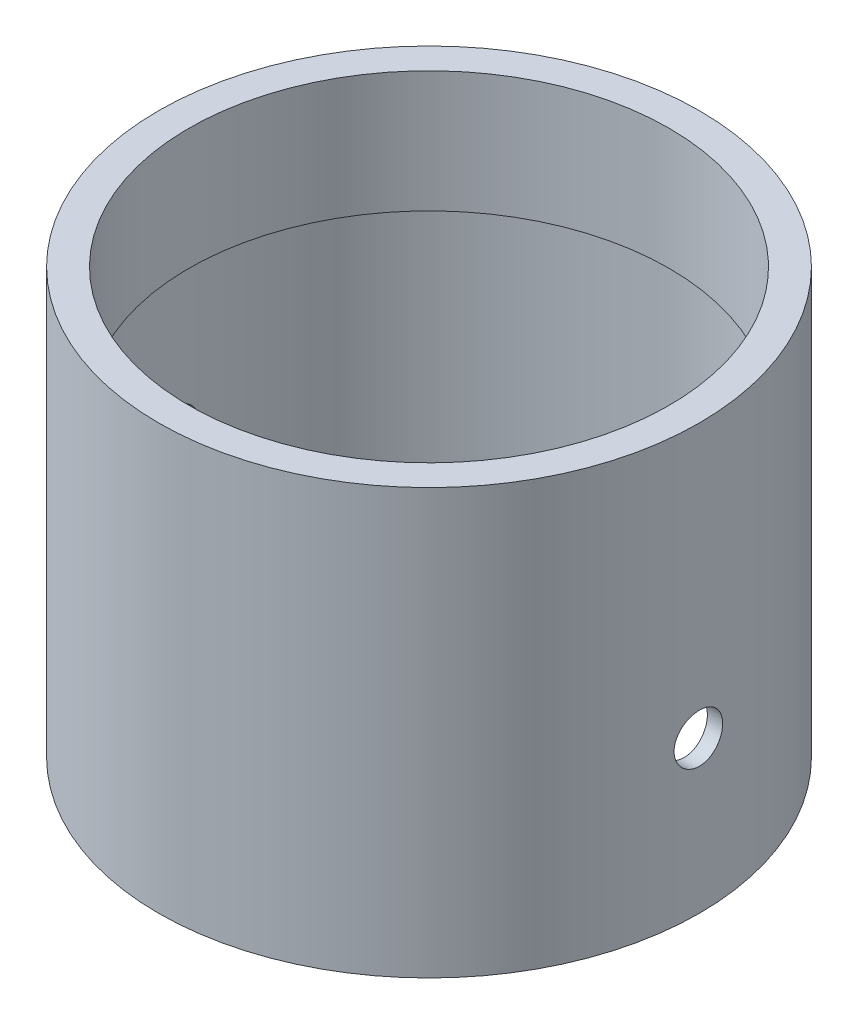
ISO-10303-21;
HEADER;
FILE_DESCRIPTION(('STEP AP214'),'2;1');
FILE_NAME('part.step','',(''),(''),'','','');
FILE_SCHEMA(('AUTOMOTIVE_DESIGN { 1 0 10303 214 1 1 1 1 }'));
ENDSEC;
DATA;
#1=APPLICATION_CONTEXT('core data for automotive mechanical design processes');
#2=APPLICATION_PROTOCOL_DEFINITION('international standard','automotive_design',2000,#1);
#3=PRODUCT_CONTEXT('',#1,'mechanical');
#4=PRODUCT('Part','Part','',(#3));
#5=PRODUCT_RELATED_PRODUCT_CATEGORY('part','',(#4));
#6=PRODUCT_DEFINITION_FORMATION('','',#4);
#7=PRODUCT_DEFINITION_CONTEXT('part definition',#1,'design');
#8=PRODUCT_DEFINITION('design','',#6,#7);
#9=PRODUCT_DEFINITION_SHAPE('','',#8);
#10=(LENGTH_UNIT() NAMED_UNIT(*) SI_UNIT(.MILLI.,.METRE.));
#11=(NAMED_UNIT(*) PLANE_ANGLE_UNIT() SI_UNIT($,.RADIAN.));
#12=(NAMED_UNIT(*) SI_UNIT($,.STERADIAN.) SOLID_ANGLE_UNIT());
#13=UNCERTAINTY_MEASURE_WITH_UNIT(LENGTH_MEASURE(1.E-05),#10,'distance_accuracy_value','');
#14=(GEOMETRIC_REPRESENTATION_CONTEXT(3) GLOBAL_UNCERTAINTY_ASSIGNED_CONTEXT((#13)) GLOBAL_UNIT_ASSIGNED_CONTEXT((#10,
#11,#12)) REPRESENTATION_CONTEXT('',''));
#15=CARTESIAN_POINT('',(0.,0.,0.));
#16=DIRECTION('',(0.,0.,1.));
#17=DIRECTION('',(1.,0.,0.));
#18=AXIS2_PLACEMENT_3D('',#15,#16,#17);
#19=CARTESIAN_POINT('',(0.,10.,0.));
#20=DIRECTION('',(0.,-1.,0.));
#21=DIRECTION('',(0.,0.,-1.));
#22=AXIS2_PLACEMENT_3D('',#19,#20,#21);
#23=CYLINDRICAL_SURFACE('',#22,19.7871926);
#24=CARTESIAN_POINT('',(0.,-20.,0.));
#25=DIRECTION('',(0.,-1.,0.));
#26=DIRECTION('',(0.,0.,-1.));
#27=AXIS2_PLACEMENT_3D('',#24,#25,#26);
#28=CIRCLE('',#27,19.7871926);
#29=CARTESIAN_POINT('',(0.,-20.,-19.7871926));
#30=VERTEX_POINT('',#29);
#31=EDGE_CURVE('E123',#30,#30,#28,.F.);
#32=ORIENTED_EDGE('',*,*,#31,.T.);
#33=EDGE_LOOP('',(#32));
#34=FACE_BOUND('',#33,.T.);
#35=CARTESIAN_POINT('',(0.,-30.,0.));
#36=DIRECTION('',(0.,-1.,0.));
#37=DIRECTION('',(0.,0.,-1.));
#38=AXIS2_PLACEMENT_3D('',#35,#36,#37);
#39=CIRCLE('',#38,19.7871926);
#40=CARTESIAN_POINT('',(0.,-30.,-19.7871926));
#41=VERTEX_POINT('',#40);
#42=EDGE_CURVE('E126',#41,#41,#39,.T.);
#43=ORIENTED_EDGE('',*,*,#42,.T.);
#44=EDGE_LOOP('',(#43));
#45=FACE_BOUND('',#44,.T.);
#46=ADVANCED_FACE('F42',(#34,#45),#23,.F.);
#47=CARTESIAN_POINT('',(0.,-55.,0.));
#48=DIRECTION('',(0.,1.,0.));
#49=DIRECTION('',(0.,0.,1.));
#50=AXIS2_PLACEMENT_3D('',#47,#48,#49);
#51=CYLINDRICAL_SURFACE('',#50,22.2871926);
#52=CARTESIAN_POINT('',(22.1972735710829,-42.5,2.));
#53=CARTESIAN_POINT('',(22.1972747578384,-42.6120979487833,1.99999511742206));
#54=CARTESIAN_POINT('',(22.1981318713446,-42.7242714162903,1.990543818689));
#55=CARTESIAN_POINT('',(22.2014675221558,-42.9455123542723,1.95298122193684));
#56=CARTESIAN_POINT('',(22.2039478783657,-43.0545761970581,1.92484899070827));
#57=CARTESIAN_POINT('',(22.210246844414,-43.2663616954607,1.85074673635096));
#58=CARTESIAN_POINT('',(22.2140646763531,-43.3690869969256,1.8047870803025));
#59=CARTESIAN_POINT('',(22.2226074531708,-43.5653415959197,1.69635359363768));
#60=CARTESIAN_POINT('',(22.2273322090682,-43.6588728031483,1.63388320244131));
#61=CARTESIAN_POINT('',(22.2371721337219,-43.8343842266705,1.49400257964117));
#62=CARTESIAN_POINT('',(22.2422882941835,-43.9163334959603,1.41655358427251));
#63=CARTESIAN_POINT('',(22.2523255157385,-44.0660886952276,1.24899661663564));
#64=CARTESIAN_POINT('',(22.2572465681556,-44.1338939968124,1.15888808222299));
#65=CARTESIAN_POINT('',(22.2663486688275,-44.2535411573696,0.968383200456265));
#66=CARTESIAN_POINT('',(22.2705284588251,-44.3053559815363,0.867969808575246));
#67=CARTESIAN_POINT('',(22.2776663557045,-44.391378424981,0.659824263836162));
#68=CARTESIAN_POINT('',(22.2806244870105,-44.4255863962678,0.552092257345798));
#69=CARTESIAN_POINT('',(22.2849788219677,-44.4753343035201,0.332677649173622));
#70=CARTESIAN_POINT('',(22.2863792415886,-44.4909246368645,0.221006559086602));
#71=CARTESIAN_POINT('',(22.2874746715091,-44.5031505637352,-0.00337546761511587));
#72=CARTESIAN_POINT('',(22.287169718065,-44.4997865602311,-0.116086382072268));
#73=CARTESIAN_POINT('',(22.2848922298026,-44.4742404087816,-0.339006741680388));
#74=CARTESIAN_POINT('',(22.2829244974277,-44.4521124542975,-0.44922245317486));
#75=CARTESIAN_POINT('',(22.2775482296399,-44.389750856663,-0.664369168517825));
#76=CARTESIAN_POINT('',(22.2741396786775,-44.3495170181116,-0.769300115318885));
#77=CARTESIAN_POINT('',(22.2662568836501,-44.2520256990304,-0.971070558621094));
#78=CARTESIAN_POINT('',(22.2617811285953,-44.1947440527419,-1.06789831730319));
#79=CARTESIAN_POINT('',(22.252266629674,-44.0648006794693,-1.25058570005472));
#80=CARTESIAN_POINT('',(22.2472278725395,-43.992138589982,-1.33644506553248));
#81=CARTESIAN_POINT('',(22.2371323841951,-43.8331917383666,-1.49507549578169));
#82=CARTESIAN_POINT('',(22.2320756522269,-43.7468598662908,-1.56779936485416));
#83=CARTESIAN_POINT('',(22.2225319486924,-43.5631879647968,-1.69772953841518));
#84=CARTESIAN_POINT('',(22.2180449777122,-43.465847924058,-1.75493582694544));
#85=CARTESIAN_POINT('',(22.2101481626183,-43.2628885373283,-1.8522057349068));
#86=CARTESIAN_POINT('',(22.2067384830431,-43.1572679296896,-1.89226673600946));
#87=CARTESIAN_POINT('',(22.2013856168003,-42.9407621652327,-1.95407307096022));
#88=CARTESIAN_POINT('',(22.1994423943012,-42.8298771371162,-1.97581885232471));
#89=CARTESIAN_POINT('',(22.1972484360612,-42.6064036214521,-2.00031736919359));
#90=CARTESIAN_POINT('',(22.1969918287129,-42.4938224126005,-2.0031359964759));
#91=CARTESIAN_POINT('',(22.1981846600312,-42.2697891652291,-1.98987295841871));
#92=CARTESIAN_POINT('',(22.1996340802026,-42.1583371144812,-1.97379149797679));
#93=CARTESIAN_POINT('',(22.2040703057082,-41.9399161135504,-1.92323978146857));
#94=CARTESIAN_POINT('',(22.2070545275864,-41.8329399554907,-1.8888004228082));
#95=CARTESIAN_POINT('',(22.2142219880295,-41.626283842992,-1.80254197486506));
#96=CARTESIAN_POINT('',(22.2184052488387,-41.5266040239564,-1.75072256314741));
#97=CARTESIAN_POINT('',(22.2275136706671,-41.3370690385478,-1.63100884413621));
#98=CARTESIAN_POINT('',(22.2324408405437,-41.2472416476623,-1.56307071688196));
#99=CARTESIAN_POINT('',(22.2424752044135,-41.0802424516452,-1.41311119297578));
#100=CARTESIAN_POINT('',(22.2475824019941,-41.0030708988815,-1.33108951555269));
#101=CARTESIAN_POINT('',(22.2574189441875,-40.8633482437915,-1.15500604030694));
#102=CARTESIAN_POINT('',(22.2621471547689,-40.8008400162027,-1.06091014917612));
#103=CARTESIAN_POINT('',(22.2706765810179,-40.6925128786339,-0.86351861798024));
#104=CARTESIAN_POINT('',(22.274477807211,-40.6466937791547,-0.760223082390508));
#105=CARTESIAN_POINT('',(22.2807197891287,-40.573118809232,-0.547516632091033));
#106=CARTESIAN_POINT('',(22.2831625240799,-40.5453366502939,-0.438114870976024));
#107=CARTESIAN_POINT('',(22.2864203628508,-40.5085383192264,-0.216176534935294));
#108=CARTESIAN_POINT('',(22.2872355028901,-40.4995217294991,-0.103640029824802));
#109=CARTESIAN_POINT('',(22.2871463372315,-40.5005157111944,0.120951224744843));
#110=CARTESIAN_POINT('',(22.2862480611426,-40.51045955971,0.233006277913697));
#111=CARTESIAN_POINT('',(22.2828449011884,-40.5489527269693,0.453847763078015));
#112=CARTESIAN_POINT('',(22.2803400154438,-40.5775020674764,0.562634191249944));
#113=CARTESIAN_POINT('',(22.274004533651,-40.6523782735406,0.773852904445495));
#114=CARTESIAN_POINT('',(22.2701740481596,-40.6987036565854,0.876285718529793));
#115=CARTESIAN_POINT('',(22.2616153388955,-40.8078095394719,1.07193140249993));
#116=CARTESIAN_POINT('',(22.256887126052,-40.870589838988,1.16514438461094));
#117=CARTESIAN_POINT('',(22.2470434449778,-41.0110740219129,1.34004620070506));
#118=CARTESIAN_POINT('',(22.2419267265873,-41.0888274361339,1.42169518049074));
#119=CARTESIAN_POINT('',(22.2318933661685,-41.2569574867111,1.57081920110572));
#120=CARTESIAN_POINT('',(22.2269767727254,-41.3473371650655,1.63829081639756));
#121=CARTESIAN_POINT('',(22.2178891383573,-41.5383568240451,1.7572518750741));
#122=CARTESIAN_POINT('',(22.2137196945828,-41.6390180791851,1.80870725014414));
#123=CARTESIAN_POINT('',(22.2066177291929,-41.8475220214507,1.89391873429749));
#124=CARTESIAN_POINT('',(22.2036837959954,-41.9553563492023,1.92769505264626));
#125=CARTESIAN_POINT('',(22.200134296723,-42.1365148062639,1.96805217594431));
#126=CARTESIAN_POINT('',(22.1990665072282,-42.2086762287153,1.98001652304328));
#127=CARTESIAN_POINT('',(22.1976357587225,-42.3538810718456,1.99599201375689));
#128=CARTESIAN_POINT('',(22.197272797449,-42.4269244896922,2.00000318290279));
#129=CARTESIAN_POINT('',(22.1972735710829,-42.5,2.));
#130=B_SPLINE_CURVE_WITH_KNOTS('',3,(#52,#53,#54,#55,#56,#57,#58,#59,#60,#61,#62,#63,#64,#65,
#66,#67,#68,#69,#70,#71,#72,#73,#74,#75,#76,#77,#78,#79,#80,#81,#82,#83,#84,#85,#86,#87,#88,#89,
#90,#91,#92,#93,#94,#95,#96,#97,#98,#99,#100,#101,#102,#103,#104,#105,#106,#107,#108,#109,#110,
#111,#112,#113,#114,#115,#116,#117,#118,#119,#120,#121,#122,#123,#124,#125,#126,#127,#128,#129),
.UNSPECIFIED.,.T.,.F.,(4,2,2,2,2,2,2,2,2,2,2,2,2,2,2,2,2,2,2,2,2,2,2,2,2,2,2,2,2,2,2,2,2,2,2,2,
2,2,4),(0.,0.336027017428791,0.672431212005181,1.0086400719516,1.34477894995675,
1.68179966672603,2.01883535356938,2.35643777760468,2.69403345178984,3.03071317808978,
3.3673857465999,3.70308924674595,4.03879636993308,4.37498165278979,4.71117486011395,
5.04855296639093,5.38593141962668,5.7233613769663,6.06078308926081,6.39702951152463,
6.73327228854404,7.06895092809568,7.40463579550453,7.74124392135059,8.07785875863147,
8.41544590096338,8.75302920999184,9.09011938664503,9.42720206181136,9.76310071191315,
10.0989997549234,10.4348707902195,10.7707377367398,11.1077354274279,11.4448144501677,
11.7826056533358,12.1200098729808,12.3390631640554,12.5581157519247),.UNSPECIFIED.);
#131=CARTESIAN_POINT('',(22.1972735710829,-42.5,2.));
#132=VERTEX_POINT('',#131);
#133=EDGE_CURVE('E95',#132,#132,#130,.T.);
#134=ORIENTED_EDGE('',*,*,#133,.F.);
#135=EDGE_LOOP('',(#134));
#136=FACE_BOUND('',#135,.T.);
#137=CARTESIAN_POINT('',(-22.1972735710829,-42.5,2.));
#138=CARTESIAN_POINT('',(-22.1972747578384,-42.3879020512167,1.99999511742206));
#139=CARTESIAN_POINT('',(-22.1981318713446,-42.2757285837097,1.990543818689));
#140=CARTESIAN_POINT('',(-22.2014675221558,-42.0544876457277,1.95298122193684));
#141=CARTESIAN_POINT('',(-22.2039478783657,-41.9454238029419,1.92484899070827));
#142=CARTESIAN_POINT('',(-22.210246844414,-41.7336383045392,1.85074673635096));
#143=CARTESIAN_POINT('',(-22.2140646763531,-41.6309130030744,1.8047870803025));
#144=CARTESIAN_POINT('',(-22.2226074531708,-41.4346584040803,1.69635359363767));
#145=CARTESIAN_POINT('',(-22.2273322090682,-41.3411271968517,1.63388320244131));
#146=CARTESIAN_POINT('',(-22.2371721337219,-41.1656157733295,1.49400257964117));
#147=CARTESIAN_POINT('',(-22.2422882941835,-41.0836665040397,1.41655358427251));
#148=CARTESIAN_POINT('',(-22.2523255157385,-40.9339113047724,1.24899661663564));
#149=CARTESIAN_POINT('',(-22.2572465681556,-40.8661060031876,1.15888808222299));
#150=CARTESIAN_POINT('',(-22.2663486688275,-40.7464588426304,0.968383200456265));
#151=CARTESIAN_POINT('',(-22.2705284588251,-40.6946440184637,0.867969808575246));
#152=CARTESIAN_POINT('',(-22.2776663557045,-40.6086215750189,0.659824263836162));
#153=CARTESIAN_POINT('',(-22.2806244870105,-40.5744136037321,0.552092257345798));
#154=CARTESIAN_POINT('',(-22.2849788219677,-40.5246656964799,0.332677649173622));
#155=CARTESIAN_POINT('',(-22.2863792415886,-40.5090753631355,0.221006559086602));
#156=CARTESIAN_POINT('',(-22.2874746715091,-40.4968494362648,-0.00337546761511587));
#157=CARTESIAN_POINT('',(-22.287169718065,-40.5002134397689,-0.116086382072268));
#158=CARTESIAN_POINT('',(-22.2848922298026,-40.5257595912184,-0.339006741680388));
#159=CARTESIAN_POINT('',(-22.2829244974277,-40.5478875457025,-0.44922245317486));
#160=CARTESIAN_POINT('',(-22.2775482296399,-40.610249143337,-0.664369168517825));
#161=CARTESIAN_POINT('',(-22.2741396786775,-40.6504829818884,-0.769300115318885));
#162=CARTESIAN_POINT('',(-22.2662568836501,-40.7479743009695,-0.971070558621094));
#163=CARTESIAN_POINT('',(-22.2617811285953,-40.8052559472581,-1.06789831730319));
#164=CARTESIAN_POINT('',(-22.252266629674,-40.9351993205307,-1.25058570005472));
#165=CARTESIAN_POINT('',(-22.2472278725395,-41.007861410018,-1.33644506553248));
#166=CARTESIAN_POINT('',(-22.2371323841951,-41.1668082616334,-1.49507549578169));
#167=CARTESIAN_POINT('',(-22.2320756522269,-41.2531401337092,-1.56779936485416));
#168=CARTESIAN_POINT('',(-22.2225319486924,-41.4368120352031,-1.69772953841518));
#169=CARTESIAN_POINT('',(-22.2180449777122,-41.534152075942,-1.75493582694544));
#170=CARTESIAN_POINT('',(-22.2101481626183,-41.7371114626716,-1.8522057349068));
#171=CARTESIAN_POINT('',(-22.2067384830431,-41.8427320703104,-1.89226673600946));
#172=CARTESIAN_POINT('',(-22.2013856168003,-42.0592378347672,-1.95407307096023));
#173=CARTESIAN_POINT('',(-22.1994423943012,-42.1701228628838,-1.97581885232471));
#174=CARTESIAN_POINT('',(-22.1972484360612,-42.3935963785479,-2.00031736919359));
#175=CARTESIAN_POINT('',(-22.1969918287129,-42.5061775873995,-2.0031359964759));
#176=CARTESIAN_POINT('',(-22.1981846600312,-42.7302108347709,-1.98987295841871));
#177=CARTESIAN_POINT('',(-22.1996340802026,-42.8416628855188,-1.97379149797679));
#178=CARTESIAN_POINT('',(-22.2040703057082,-43.0600838864496,-1.92323978146857));
#179=CARTESIAN_POINT('',(-22.2070545275864,-43.1670600445093,-1.8888004228082));
#180=CARTESIAN_POINT('',(-22.2142219880295,-43.373716157008,-1.80254197486506));
#181=CARTESIAN_POINT('',(-22.2184052488387,-43.4733959760435,-1.75072256314741));
#182=CARTESIAN_POINT('',(-22.2275136706671,-43.6629309614522,-1.63100884413621));
#183=CARTESIAN_POINT('',(-22.2324408405437,-43.7527583523377,-1.56307071688196));
#184=CARTESIAN_POINT('',(-22.2424752044135,-43.9197575483548,-1.41311119297578));
#185=CARTESIAN_POINT('',(-22.2475824019941,-43.9969291011185,-1.33108951555269));
#186=CARTESIAN_POINT('',(-22.2574189441875,-44.1366517562085,-1.15500604030694));
#187=CARTESIAN_POINT('',(-22.2621471547689,-44.1991599837973,-1.06091014917612));
#188=CARTESIAN_POINT('',(-22.2706765810179,-44.3074871213661,-0.863518617980242));
#189=CARTESIAN_POINT('',(-22.274477807211,-44.3533062208453,-0.760223082390509));
#190=CARTESIAN_POINT('',(-22.2807197891287,-44.426881190768,-0.547516632091033));
#191=CARTESIAN_POINT('',(-22.2831625240799,-44.4546633497061,-0.438114870976024));
#192=CARTESIAN_POINT('',(-22.2864203628508,-44.4914616807736,-0.216176534935294));
#193=CARTESIAN_POINT('',(-22.2872355028901,-44.5004782705009,-0.103640029824802));
#194=CARTESIAN_POINT('',(-22.2871463372315,-44.4994842888056,0.120951224744843));
#195=CARTESIAN_POINT('',(-22.2862480611426,-44.48954044029,0.233006277913697));
#196=CARTESIAN_POINT('',(-22.2828449011884,-44.4510472730307,0.453847763078015));
#197=CARTESIAN_POINT('',(-22.2803400154438,-44.4224979325236,0.562634191249944));
#198=CARTESIAN_POINT('',(-22.274004533651,-44.3476217264594,0.773852904445493));
#199=CARTESIAN_POINT('',(-22.2701740481596,-44.3012963434146,0.876285718529788));
#200=CARTESIAN_POINT('',(-22.2616153388955,-44.1921904605281,1.07193140249992));
#201=CARTESIAN_POINT('',(-22.256887126052,-44.129410161012,1.16514438461094));
#202=CARTESIAN_POINT('',(-22.2470434449778,-43.9889259780871,1.34004620070505));
#203=CARTESIAN_POINT('',(-22.2419267265873,-43.9111725638661,1.42169518049073));
#204=CARTESIAN_POINT('',(-22.2318933661685,-43.7430425132889,1.57081920110572));
#205=CARTESIAN_POINT('',(-22.2269767727254,-43.6526628349345,1.63829081639756));
#206=CARTESIAN_POINT('',(-22.2178891383573,-43.4616431759549,1.7572518750741));
#207=CARTESIAN_POINT('',(-22.2137196945828,-43.3609819208149,1.80870725014414));
#208=CARTESIAN_POINT('',(-22.2066177291929,-43.1524779785493,1.89391873429749));
#209=CARTESIAN_POINT('',(-22.2036837959954,-43.0446436507977,1.92769505264626));
#210=CARTESIAN_POINT('',(-22.200134296723,-42.8634851937361,1.96805217594431));
#211=CARTESIAN_POINT('',(-22.1990665072282,-42.7913237712847,1.98001652304328));
#212=CARTESIAN_POINT('',(-22.1976357587225,-42.6461189281544,1.99599201375689));
#213=CARTESIAN_POINT('',(-22.197272797449,-42.5730755103078,2.00000318290279));
#214=CARTESIAN_POINT('',(-22.1972735710829,-42.5,2.));
#215=B_SPLINE_CURVE_WITH_KNOTS('',3,(#137,#138,#139,#140,#141,#142,#143,#144,#145,#146,#147,
#148,#149,#150,#151,#152,#153,#154,#155,#156,#157,#158,#159,#160,#161,#162,#163,#164,#165,#166,
#167,#168,#169,#170,#171,#172,#173,#174,#175,#176,#177,#178,#179,#180,#181,#182,#183,#184,#185,
#186,#187,#188,#189,#190,#191,#192,#193,#194,#195,#196,#197,#198,#199,#200,#201,#202,#203,#204,
#205,#206,#207,#208,#209,#210,#211,#212,#213,#214),.UNSPECIFIED.,.T.,.F.,(4,2,2,2,2,2,2,2,2,2,2,
2,2,2,2,2,2,2,2,2,2,2,2,2,2,2,2,2,2,2,2,2,2,2,2,2,2,2,4),(0.,0.336027017428791,
0.672431212005181,1.00864007195161,1.34477894995675,1.68179966672603,2.01883535356938,
2.35643777760468,2.69403345178984,3.03071317808978,3.3673857465999,3.70308924674595,
4.03879636993308,4.37498165278979,4.71117486011395,5.04855296639093,5.38593141962668,
5.7233613769663,6.06078308926081,6.39702951152464,6.73327228854404,7.06895092809568,
7.40463579550453,7.74124392135059,8.07785875863147,8.41544590096338,8.75302920999184,
9.09011938664503,9.42720206181136,9.76310071191314,10.0989997549234,10.4348707902195,
10.7707377367398,11.1077354274279,11.4448144501676,11.7826056533358,12.1200098729808,
12.3390631640554,12.5581157519247),.UNSPECIFIED.);
#216=CARTESIAN_POINT('',(-22.1972735710829,-42.5,2.));
#217=VERTEX_POINT('',#216);
#218=EDGE_CURVE('E88',#217,#217,#215,.T.);
#219=ORIENTED_EDGE('',*,*,#218,.F.);
#220=EDGE_LOOP('',(#219));
#221=FACE_BOUND('',#220,.T.);
#222=CARTESIAN_POINT('',(0.,-55.,0.));
#223=DIRECTION('',(0.,-1.,0.));
#224=DIRECTION('',(0.,0.,-1.));
#225=AXIS2_PLACEMENT_3D('',#222,#223,#224);
#226=CIRCLE('',#225,22.2871926);
#227=CARTESIAN_POINT('',(0.,-55.,-22.2871926));
#228=VERTEX_POINT('',#227);
#229=EDGE_CURVE('E10',#228,#228,#226,.T.);
#230=ORIENTED_EDGE('',*,*,#229,.F.);
#231=EDGE_LOOP('',(#230));
#232=FACE_BOUND('',#231,.T.);
#233=CARTESIAN_POINT('',(0.,-20.,0.));
#234=DIRECTION('',(0.,1.,0.));
#235=DIRECTION('',(0.,0.,1.));
#236=AXIS2_PLACEMENT_3D('',#233,#234,#235);
#237=CIRCLE('',#236,22.2871926);
#238=CARTESIAN_POINT('',(0.,-20.,22.2871926));
#239=VERTEX_POINT('',#238);
#240=EDGE_CURVE('E70',#239,#239,#237,.T.);
#241=ORIENTED_EDGE('',*,*,#240,.F.);
#242=EDGE_LOOP('',(#241));
#243=FACE_BOUND('',#242,.T.);
#244=ADVANCED_FACE('F101',(#136,#221,#232,#243),#51,.T.);
#245=CARTESIAN_POINT('',(0.,-30.,0.));
#246=DIRECTION('',(0.,-1.,0.));
#247=DIRECTION('',(0.,0.,-1.));
#248=AXIS2_PLACEMENT_3D('',#245,#246,#247);
#249=CYLINDRICAL_SURFACE('',#248,21.0371926);
#250=CARTESIAN_POINT('',(0.,-30.,0.));
#251=DIRECTION('',(0.,-1.,0.));
#252=DIRECTION('',(0.,0.,-1.));
#253=AXIS2_PLACEMENT_3D('',#250,#251,#252);
#254=CIRCLE('',#253,21.0371926);
#255=CARTESIAN_POINT('',(0.,-30.,-21.0371926));
#256=VERTEX_POINT('',#255);
#257=EDGE_CURVE('E55',#256,#256,#254,.T.);
#258=ORIENTED_EDGE('',*,*,#257,.F.);
#259=EDGE_LOOP('',(#258));
#260=FACE_BOUND('',#259,.T.);
#261=CARTESIAN_POINT('',(0.,-55.,0.));
#262=DIRECTION('',(0.,-1.,0.));
#263=DIRECTION('',(0.,0.,-1.));
#264=AXIS2_PLACEMENT_3D('',#261,#262,#263);
#265=CIRCLE('',#264,21.0371926);
#266=CARTESIAN_POINT('',(0.,-55.,-21.0371926));
#267=VERTEX_POINT('',#266);
#268=EDGE_CURVE('E61',#267,#267,#265,.T.);
#269=ORIENTED_EDGE('',*,*,#268,.T.);
#270=EDGE_LOOP('',(#269));
#271=FACE_BOUND('',#270,.T.);
#272=CARTESIAN_POINT('',(-20.9419070881688,-42.5,2.));
#273=CARTESIAN_POINT('',(-20.9419083413363,-42.6120681851692,1.99999513201458));
#274=CARTESIAN_POINT('',(-20.9428163597082,-42.7242111611602,1.99054882838601));
#275=CARTESIAN_POINT('',(-20.9463499676321,-42.945389909875,1.95300723820346));
#276=CARTESIAN_POINT('',(-20.9489774667533,-43.0544220872463,1.92489121748735));
#277=CARTESIAN_POINT('',(-20.9556497833662,-43.2661440846311,1.85083454002998));
#278=CARTESIAN_POINT('',(-20.9596937590213,-43.3688376292584,1.80490446875215));
#279=CARTESIAN_POINT('',(-20.9687423332486,-43.5650349564377,1.69654334919544));
#280=CARTESIAN_POINT('',(-20.9737467363954,-43.6585406026769,1.63411565683704));
#281=CARTESIAN_POINT('',(-20.9841708053427,-43.8340393112503,1.49430974200621));
#282=CARTESIAN_POINT('',(-20.9895916457219,-43.9159978133087,1.4168882193762));
#283=CARTESIAN_POINT('',(-21.0002271079792,-44.0657783354441,1.24938464715165));
#284=CARTESIAN_POINT('',(-21.0054417205491,-44.1335997180128,1.15930202691602));
#285=CARTESIAN_POINT('',(-21.0150886553621,-44.2532990372019,0.968823172608425));
#286=CARTESIAN_POINT('',(-21.0195194791809,-44.3051465728206,0.868407751815739));
#287=CARTESIAN_POINT('',(-21.0270868551762,-44.3912319623651,0.660247122460799));
#288=CARTESIAN_POINT('',(-21.0302234360967,-44.4254702073817,0.552502076744871));
#289=CARTESIAN_POINT('',(-21.0348406839719,-44.4752642664908,0.333088507012164));
#290=CARTESIAN_POINT('',(-21.0363263611574,-44.4908766178924,0.221432920763002));
#291=CARTESIAN_POINT('',(-21.0374914281367,-44.503150598913,-0.00292298633593523));
#292=CARTESIAN_POINT('',(-21.0371708606019,-44.49981267622,-0.11562328244232));
#293=CARTESIAN_POINT('',(-21.0347636682501,-44.474326862005,-0.338485800052362));
#294=CARTESIAN_POINT('',(-21.0326827515386,-44.4522397657245,-0.448655044151479));
#295=CARTESIAN_POINT('',(-21.0269953428753,-44.3899772304994,-0.663715646732791));
#296=CARTESIAN_POINT('',(-21.0233888327512,-44.3498015760904,-0.768606942329425));
#297=CARTESIAN_POINT('',(-21.0150459731244,-44.2524353593934,-0.970326378206364));
#298=CARTESIAN_POINT('',(-21.010307832801,-44.1952177922147,-1.06714140666164));
#299=CARTESIAN_POINT('',(-21.0002336264524,-44.0654115543207,-1.24981700137036));
#300=CARTESIAN_POINT('',(-20.9948975445921,-43.9928224764821,-1.33567727738439));
#301=CARTESIAN_POINT('',(-20.9842016341831,-43.8339916104411,-1.4943619999207));
#302=CARTESIAN_POINT('',(-20.9788417951928,-43.7476969545077,-1.56713353968094));
#303=CARTESIAN_POINT('',(-20.9687235713229,-43.5640881151839,-1.6971657406473));
#304=CARTESIAN_POINT('',(-20.9639651871842,-43.4667739182192,-1.75442638274627));
#305=CARTESIAN_POINT('',(-20.9555880675547,-43.2638488352008,-1.85181055977301));
#306=CARTESIAN_POINT('',(-20.9519695385038,-43.158236450579,-1.89193099089337));
#307=CARTESIAN_POINT('',(-20.9462860480425,-42.9417322842461,-1.95385485629721));
#308=CARTESIAN_POINT('',(-20.9442210439408,-42.8308406476993,-1.97565879392502));
#309=CARTESIAN_POINT('',(-20.941885669953,-42.6073897741459,-2.000263022369));
#310=CARTESIAN_POINT('',(-20.9416083173673,-42.4948387488602,-2.00313725498146));
#311=CARTESIAN_POINT('',(-20.9428612226345,-42.2708566069534,-1.9899945151607));
#312=CARTESIAN_POINT('',(-20.9443914584512,-42.1594254766963,-1.97397777302668));
#313=CARTESIAN_POINT('',(-20.9490807654374,-41.9410607499501,-1.92356953450102));
#314=CARTESIAN_POINT('',(-20.9522367496572,-41.8341190437223,-1.88921285727139));
#315=CARTESIAN_POINT('',(-20.9598194337728,-41.6275170365796,-1.80313550801036));
#316=CARTESIAN_POINT('',(-20.9642461600532,-41.5278568869064,-1.75141447543753));
#317=CARTESIAN_POINT('',(-20.9738884617107,-41.33830952917,-1.63189076577129));
#318=CARTESIAN_POINT('',(-20.9791064268696,-41.2484533961032,-1.56403900397166));
#319=CARTESIAN_POINT('',(-20.9897353736042,-41.0813795479059,-1.41425042003072));
#320=CARTESIAN_POINT('',(-20.9951463594961,-41.0041621156109,-1.33231328276353));
#321=CARTESIAN_POINT('',(-21.0055726573487,-40.8643034173128,-1.15635945804998));
#322=CARTESIAN_POINT('',(-21.0105866265807,-40.8017103266793,-1.06230438731366));
#323=CARTESIAN_POINT('',(-21.0196344691152,-40.6932083061394,-0.86497468159434));
#324=CARTESIAN_POINT('',(-21.0236683547174,-40.6472991668523,-0.761700162334143));
#325=CARTESIAN_POINT('',(-21.0302954222428,-40.5735502183128,-0.54903271088279));
#326=CARTESIAN_POINT('',(-21.0328909405232,-40.5456810939977,-0.439650020342412));
#327=CARTESIAN_POINT('',(-21.036358385484,-40.5087075598461,-0.217731988173248));
#328=CARTESIAN_POINT('',(-21.0372303556203,-40.4996026769057,-0.105196726102973));
#329=CARTESIAN_POINT('',(-21.0371524633343,-40.500422367701,0.119358272151498));
#330=CARTESIAN_POINT('',(-21.036209769555,-40.510272063278,0.231378291704006));
#331=CARTESIAN_POINT('',(-21.032622620045,-40.548564572215,0.45216492877933));
#332=CARTESIAN_POINT('',(-21.0299781626406,-40.5770074038603,0.560931543102488));
#333=CARTESIAN_POINT('',(-21.0232839019727,-40.6516585723344,0.772124975176499));
#334=CARTESIAN_POINT('',(-21.0192342516889,-40.6978649753473,0.874552481620245));
#335=CARTESIAN_POINT('',(-21.0101815361042,-40.8067235324959,1.07020932911492));
#336=CARTESIAN_POINT('',(-21.0051784793486,-40.8693755392317,1.16343875259687));
#337=CARTESIAN_POINT('',(-20.9947561577702,-41.0096279002007,1.33843667428401));
#338=CARTESIAN_POINT('',(-20.989335389176,-41.0872839401451,1.42016045408163));
#339=CARTESIAN_POINT('',(-20.9787013696893,-41.2552323954589,1.56945165676847));
#340=CARTESIAN_POINT('',(-20.973488169047,-41.3455278470974,1.63701566839741));
#341=CARTESIAN_POINT('',(-20.9638465034378,-41.5364189215892,1.75619086826012));
#342=CARTESIAN_POINT('',(-20.9594198943952,-41.6370380437217,1.8077645359426));
#343=CARTESIAN_POINT('',(-20.9518748595645,-41.8454844514405,1.89321669469507));
#344=CARTESIAN_POINT('',(-20.9487549500505,-41.9533033995562,1.9271152661882));
#345=CARTESIAN_POINT('',(-20.9449682805242,-42.1347842200757,1.96774478678936));
#346=CARTESIAN_POINT('',(-20.9438257141166,-42.2072835705456,1.97982410417126));
#347=CARTESIAN_POINT('',(-20.9422947087958,-42.3531779139698,1.99595329067948));
#348=CARTESIAN_POINT('',(-20.9419062670932,-42.4265729036103,2.00000318950498));
#349=CARTESIAN_POINT('',(-20.9419070881688,-42.5,2.));
#350=B_SPLINE_CURVE_WITH_KNOTS('',3,(#272,#273,#274,#275,#276,#277,#278,#279,#280,#281,#282,
#283,#284,#285,#286,#287,#288,#289,#290,#291,#292,#293,#294,#295,#296,#297,#298,#299,#300,#301,
#302,#303,#304,#305,#306,#307,#308,#309,#310,#311,#312,#313,#314,#315,#316,#317,#318,#319,#320,
#321,#322,#323,#324,#325,#326,#327,#328,#329,#330,#331,#332,#333,#334,#335,#336,#337,#338,#339,
#340,#341,#342,#343,#344,#345,#346,#347,#348,#349),.UNSPECIFIED.,.T.,.F.,(4,2,2,2,2,2,2,2,2,2,2,
2,2,2,2,2,2,2,2,2,2,2,2,2,2,2,2,2,2,2,2,2,2,2,2,2,2,2,4),(0.,0.335936427677572,
0.672246564070316,1.00835716370643,1.34439944480396,1.68142704497219,2.01846983999266,
2.35615017901219,2.69382301804987,3.03046825077596,3.36710553050979,3.70265539642841,
4.03820925940147,4.37429770128889,4.71039504578437,5.04782182749956,5.3852490248734,
5.72273729883338,6.06021629818141,6.39637627648992,6.73253215672657,7.0680520885261,
7.40357898725942,7.74014024302407,8.07670902950457,8.41437137926937,8.75202949128174,
9.08913752147559,9.42623705203838,9.76200763801476,10.0977785542039,10.4335129273246,
10.7692442914012,11.1062464864328,11.4433297762989,11.7811981319475,12.1186817992274,
12.3387882251211,12.5588938368846),.UNSPECIFIED.);
#351=CARTESIAN_POINT('',(-20.9419070881688,-42.5,2.));
#352=VERTEX_POINT('',#351);
#353=EDGE_CURVE('E64',#352,#352,#350,.T.);
#354=ORIENTED_EDGE('',*,*,#353,.F.);
#355=EDGE_LOOP('',(#354));
#356=FACE_BOUND('',#355,.T.);
#357=CARTESIAN_POINT('',(20.9419070881688,-42.5,2.));
#358=CARTESIAN_POINT('',(20.9419083413363,-42.3879318148308,1.99999513201458));
#359=CARTESIAN_POINT('',(20.9428163597082,-42.2757888388398,1.99054882838601));
#360=CARTESIAN_POINT('',(20.9463499676321,-42.054610090125,1.95300723820346));
#361=CARTESIAN_POINT('',(20.9489774667533,-41.9455779127537,1.92489121748735));
#362=CARTESIAN_POINT('',(20.9556497833662,-41.7338559153689,1.85083454002998));
#363=CARTESIAN_POINT('',(20.9596937590213,-41.6311623707416,1.80490446875215));
#364=CARTESIAN_POINT('',(20.9687423332486,-41.4349650435623,1.69654334919544));
#365=CARTESIAN_POINT('',(20.9737467363954,-41.3414593973231,1.63411565683704));
#366=CARTESIAN_POINT('',(20.9841708053427,-41.1659606887496,1.49430974200621));
#367=CARTESIAN_POINT('',(20.9895916457219,-41.0840021866913,1.4168882193762));
#368=CARTESIAN_POINT('',(21.0002271079792,-40.9342216645559,1.24938464715165));
#369=CARTESIAN_POINT('',(21.0054417205491,-40.8664002819872,1.15930202691602));
#370=CARTESIAN_POINT('',(21.0150886553621,-40.7467009627981,0.968823172608425));
#371=CARTESIAN_POINT('',(21.0195194791809,-40.6948534271794,0.868407751815739));
#372=CARTESIAN_POINT('',(21.0270868551762,-40.6087680376349,0.660247122460799));
#373=CARTESIAN_POINT('',(21.0302234360967,-40.5745297926183,0.552502076744871));
#374=CARTESIAN_POINT('',(21.0348406839719,-40.5247357335091,0.333088507012164));
#375=CARTESIAN_POINT('',(21.0363263611574,-40.5091233821076,0.221432920763002));
#376=CARTESIAN_POINT('',(21.0374914281367,-40.496849401087,-0.00292298633593523));
#377=CARTESIAN_POINT('',(21.0371708606019,-40.50018732378,-0.11562328244232));
#378=CARTESIAN_POINT('',(21.0347636682501,-40.525673137995,-0.338485800052362));
#379=CARTESIAN_POINT('',(21.0326827515386,-40.5477602342754,-0.448655044151479));
#380=CARTESIAN_POINT('',(21.0269953428753,-40.6100227695005,-0.663715646732791));
#381=CARTESIAN_POINT('',(21.0233888327512,-40.6501984239096,-0.768606942329425));
#382=CARTESIAN_POINT('',(21.0150459731244,-40.7475646406066,-0.970326378206364));
#383=CARTESIAN_POINT('',(21.010307832801,-40.8047822077853,-1.06714140666164));
#384=CARTESIAN_POINT('',(21.0002336264524,-40.9345884456793,-1.24981700137036));
#385=CARTESIAN_POINT('',(20.9948975445921,-41.0071775235179,-1.33567727738439));
#386=CARTESIAN_POINT('',(20.9842016341831,-41.1660083895589,-1.4943619999207));
#387=CARTESIAN_POINT('',(20.9788417951928,-41.2523030454923,-1.56713353968094));
#388=CARTESIAN_POINT('',(20.9687235713229,-41.4359118848161,-1.6971657406473));
#389=CARTESIAN_POINT('',(20.9639651871842,-41.5332260817808,-1.75442638274627));
#390=CARTESIAN_POINT('',(20.9555880675547,-41.7361511647992,-1.85181055977301));
#391=CARTESIAN_POINT('',(20.9519695385038,-41.841763549421,-1.89193099089337));
#392=CARTESIAN_POINT('',(20.9462860480425,-42.0582677157539,-1.95385485629721));
#393=CARTESIAN_POINT('',(20.9442210439408,-42.1691593523007,-1.97565879392502));
#394=CARTESIAN_POINT('',(20.941885669953,-42.3926102258541,-2.000263022369));
#395=CARTESIAN_POINT('',(20.9416083173673,-42.5051612511398,-2.00313725498146));
#396=CARTESIAN_POINT('',(20.9428612226345,-42.7291433930466,-1.9899945151607));
#397=CARTESIAN_POINT('',(20.9443914584512,-42.8405745233037,-1.97397777302667));
#398=CARTESIAN_POINT('',(20.9490807654374,-43.0589392500498,-1.92356953450102));
#399=CARTESIAN_POINT('',(20.9522367496572,-43.1658809562777,-1.88921285727139));
#400=CARTESIAN_POINT('',(20.9598194337728,-43.3724829634204,-1.80313550801036));
#401=CARTESIAN_POINT('',(20.9642461600532,-43.4721431130936,-1.75141447543753));
#402=CARTESIAN_POINT('',(20.9738884617107,-43.66169047083,-1.63189076577129));
#403=CARTESIAN_POINT('',(20.9791064268696,-43.7515466038968,-1.56403900397166));
#404=CARTESIAN_POINT('',(20.9897353736042,-43.9186204520941,-1.41425042003072));
#405=CARTESIAN_POINT('',(20.9951463594961,-43.9958378843891,-1.33231328276353));
#406=CARTESIAN_POINT('',(21.0055726573487,-44.1356965826872,-1.15635945804998));
#407=CARTESIAN_POINT('',(21.0105866265807,-44.1982896733207,-1.06230438731366));
#408=CARTESIAN_POINT('',(21.0196344691152,-44.3067916938605,-0.86497468159434));
#409=CARTESIAN_POINT('',(21.0236683547174,-44.3527008331477,-0.761700162334143));
#410=CARTESIAN_POINT('',(21.0302954222428,-44.4264497816872,-0.54903271088279));
#411=CARTESIAN_POINT('',(21.0328909405232,-44.4543189060023,-0.439650020342412));
#412=CARTESIAN_POINT('',(21.036358385484,-44.4912924401538,-0.217731988173248));
#413=CARTESIAN_POINT('',(21.0372303556203,-44.5003973230943,-0.105196726102973));
#414=CARTESIAN_POINT('',(21.0371524633343,-44.499577632299,0.119358272151498));
#415=CARTESIAN_POINT('',(21.036209769555,-44.489727936722,0.231378291704006));
#416=CARTESIAN_POINT('',(21.032622620045,-44.451435427785,0.45216492877933));
#417=CARTESIAN_POINT('',(21.0299781626406,-44.4229925961397,0.560931543102488));
#418=CARTESIAN_POINT('',(21.0232839019727,-44.3483414276655,0.772124975176496));
#419=CARTESIAN_POINT('',(21.0192342516889,-44.3021350246527,0.874552481620241));
#420=CARTESIAN_POINT('',(21.0101815361042,-44.1932764675041,1.07020932911492));
#421=CARTESIAN_POINT('',(21.0051784793486,-44.1306244607683,1.16343875259686));
#422=CARTESIAN_POINT('',(20.9947561577702,-43.9903720997993,1.33843667428401));
#423=CARTESIAN_POINT('',(20.989335389176,-43.9127160598549,1.42016045408162));
#424=CARTESIAN_POINT('',(20.9787013696893,-43.7447676045411,1.56945165676847));
#425=CARTESIAN_POINT('',(20.973488169047,-43.6544721529026,1.63701566839741));
#426=CARTESIAN_POINT('',(20.9638465034378,-43.4635810784108,1.75619086826011));
#427=CARTESIAN_POINT('',(20.9594198943952,-43.3629619562783,1.8077645359426));
#428=CARTESIAN_POINT('',(20.9518748595645,-43.1545155485595,1.89321669469507));
#429=CARTESIAN_POINT('',(20.9487549500505,-43.0466966004438,1.92711526618819));
#430=CARTESIAN_POINT('',(20.9449682805242,-42.8652157799243,1.96774478678936));
#431=CARTESIAN_POINT('',(20.9438257141166,-42.7927164294544,1.97982410417126));
#432=CARTESIAN_POINT('',(20.9422947087958,-42.6468220860301,1.99595329067948));
#433=CARTESIAN_POINT('',(20.9419062670932,-42.5734270963897,2.00000318950498));
#434=CARTESIAN_POINT('',(20.9419070881688,-42.5,2.));
#435=B_SPLINE_CURVE_WITH_KNOTS('',3,(#357,#358,#359,#360,#361,#362,#363,#364,#365,#366,#367,
#368,#369,#370,#371,#372,#373,#374,#375,#376,#377,#378,#379,#380,#381,#382,#383,#384,#385,#386,
#387,#388,#389,#390,#391,#392,#393,#394,#395,#396,#397,#398,#399,#400,#401,#402,#403,#404,#405,
#406,#407,#408,#409,#410,#411,#412,#413,#414,#415,#416,#417,#418,#419,#420,#421,#422,#423,#424,
#425,#426,#427,#428,#429,#430,#431,#432,#433,#434),.UNSPECIFIED.,.T.,.F.,(4,2,2,2,2,2,2,2,2,2,2,
2,2,2,2,2,2,2,2,2,2,2,2,2,2,2,2,2,2,2,2,2,2,2,2,2,2,2,4),(0.,0.335936427677578,
0.672246564070316,1.00835716370643,1.34439944480396,1.68142704497219,2.01846983999266,
2.35615017901219,2.69382301804987,3.03046825077596,3.36710553050979,3.70265539642841,
4.03820925940147,4.37429770128889,4.71039504578437,5.04782182749956,5.3852490248734,
5.72273729883338,6.06021629818141,6.39637627648993,6.73253215672657,7.0680520885261,
7.40357898725942,7.74014024302407,8.07670902950457,8.41437137926937,8.75202949128174,
9.08913752147559,9.42623705203838,9.76200763801476,10.0977785542039,10.4335129273246,
10.7692442914012,11.1062464864328,11.4433297762989,11.7811981319475,12.1186817992274,
12.3387882251211,12.5588938368846),.UNSPECIFIED.);
#436=CARTESIAN_POINT('',(20.9419070881688,-42.5,2.));
#437=VERTEX_POINT('',#436);
#438=EDGE_CURVE('E45',#437,#437,#435,.T.);
#439=ORIENTED_EDGE('',*,*,#438,.F.);
#440=EDGE_LOOP('',(#439));
#441=FACE_BOUND('',#440,.T.);
#442=ADVANCED_FACE('F71',(#260,#271,#356,#441),#249,.F.);
#443=CARTESIAN_POINT('',(0.,-55.,0.));
#444=DIRECTION('',(0.,-1.,0.));
#445=DIRECTION('',(0.,0.,-1.));
#446=AXIS2_PLACEMENT_3D('',#443,#444,#445);
#447=PLANE('',#446);
#448=ORIENTED_EDGE('',*,*,#268,.F.);
#449=EDGE_LOOP('',(#448));
#450=FACE_BOUND('',#449,.T.);
#451=ORIENTED_EDGE('',*,*,#229,.T.);
#452=EDGE_LOOP('',(#451));
#453=FACE_BOUND('',#452,.T.);
#454=ADVANCED_FACE('F105',(#450,#453),#447,.T.);
#455=CARTESIAN_POINT('',(0.,-30.,0.));
#456=DIRECTION('',(0.,-1.,0.));
#457=DIRECTION('',(0.,0.,-1.));
#458=AXIS2_PLACEMENT_3D('',#455,#456,#457);
#459=PLANE('',#458);
#460=ORIENTED_EDGE('',*,*,#42,.F.);
#461=EDGE_LOOP('',(#460));
#462=FACE_BOUND('',#461,.T.);
#463=ORIENTED_EDGE('',*,*,#257,.T.);
#464=EDGE_LOOP('',(#463));
#465=FACE_BOUND('',#464,.T.);
#466=ADVANCED_FACE('F82',(#462,#465),#459,.T.);
#467=CARTESIAN_POINT('',(25.,-42.5,0.));
#468=DIRECTION('',(-1.,0.,0.));
#469=DIRECTION('',(0.,0.,1.));
#470=AXIS2_PLACEMENT_3D('',#467,#468,#469);
#471=CYLINDRICAL_SURFACE('',#470,2.);
#472=ORIENTED_EDGE('',*,*,#353,.T.);
#473=EDGE_LOOP('',(#472));
#474=FACE_BOUND('',#473,.T.);
#475=ORIENTED_EDGE('',*,*,#218,.T.);
#476=EDGE_LOOP('',(#475));
#477=FACE_BOUND('',#476,.T.);
#478=ADVANCED_FACE('F80',(#474,#477),#471,.F.);
#479=ORIENTED_EDGE('',*,*,#438,.T.);
#480=EDGE_LOOP('',(#479));
#481=FACE_BOUND('',#480,.T.);
#482=ORIENTED_EDGE('',*,*,#133,.T.);
#483=EDGE_LOOP('',(#482));
#484=FACE_BOUND('',#483,.T.);
#485=ADVANCED_FACE('F75',(#481,#484),#471,.F.);
#486=CARTESIAN_POINT('',(0.,-20.,0.));
#487=DIRECTION('',(0.,1.,0.));
#488=DIRECTION('',(0.,0.,1.));
#489=AXIS2_PLACEMENT_3D('',#486,#487,#488);
#490=PLANE('',#489);
#491=ORIENTED_EDGE('',*,*,#240,.T.);
#492=EDGE_LOOP('',(#491));
#493=FACE_BOUND('',#492,.T.);
#494=ORIENTED_EDGE('',*,*,#31,.F.);
#495=EDGE_LOOP('',(#494));
#496=FACE_BOUND('',#495,.T.);
#497=ADVANCED_FACE('F79',(#493,#496),#490,.T.);
#498=CLOSED_SHELL('',(#46,#244,#442,#454,#466,#478,#485,#497));
#499=MANIFOLD_SOLID_BREP('B2',#498);
#500=ADVANCED_BREP_SHAPE_REPRESENTATION('',(#18,#499),#14);
#501=SHAPE_DEFINITION_REPRESENTATION(#9,#500);
ENDSEC;
END-ISO-10303-21;
